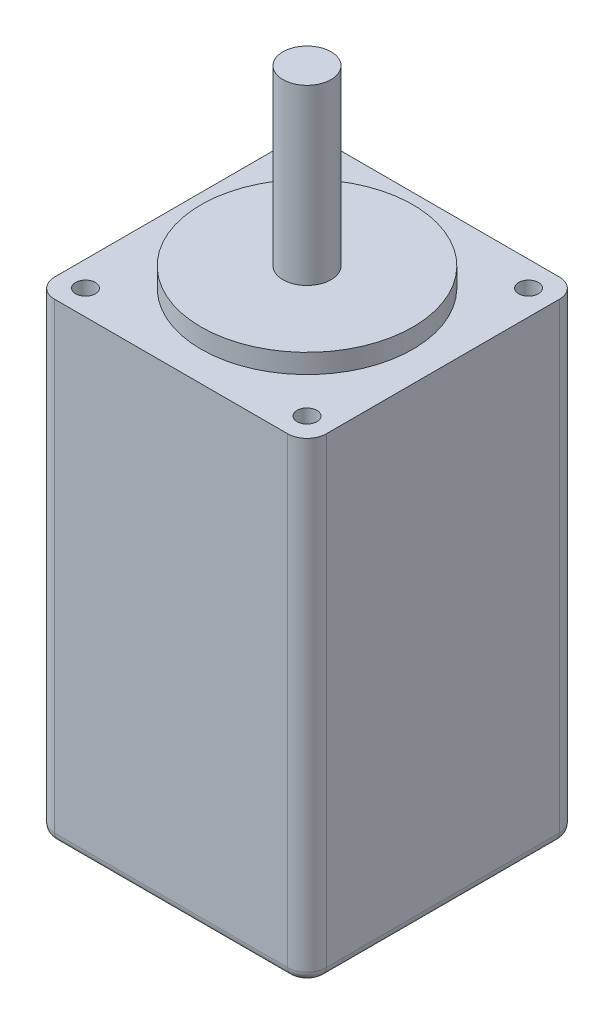
ISO-10303-21;
HEADER;
FILE_DESCRIPTION(('STEP AP214'),'2;1');
FILE_NAME('part.step','',(''),(''),'','','');
FILE_SCHEMA(('AUTOMOTIVE_DESIGN { 1 0 10303 214 1 1 1 1 }'));
ENDSEC;
DATA;
#1=APPLICATION_CONTEXT('core data for automotive mechanical design processes');
#2=APPLICATION_PROTOCOL_DEFINITION('international standard','automotive_design',2000,#1);
#3=PRODUCT_CONTEXT('',#1,'mechanical');
#4=PRODUCT('Part','Part','',(#3));
#5=PRODUCT_RELATED_PRODUCT_CATEGORY('part','',(#4));
#6=PRODUCT_DEFINITION_FORMATION('','',#4);
#7=PRODUCT_DEFINITION_CONTEXT('part definition',#1,'design');
#8=PRODUCT_DEFINITION('design','',#6,#7);
#9=PRODUCT_DEFINITION_SHAPE('','',#8);
#10=(LENGTH_UNIT() NAMED_UNIT(*) SI_UNIT(.MILLI.,.METRE.));
#11=(NAMED_UNIT(*) PLANE_ANGLE_UNIT() SI_UNIT($,.RADIAN.));
#12=(NAMED_UNIT(*) SI_UNIT($,.STERADIAN.) SOLID_ANGLE_UNIT());
#13=UNCERTAINTY_MEASURE_WITH_UNIT(LENGTH_MEASURE(1.E-05),#10,'distance_accuracy_value','');
#14=(GEOMETRIC_REPRESENTATION_CONTEXT(3) GLOBAL_UNCERTAINTY_ASSIGNED_CONTEXT((#13)) GLOBAL_UNIT_ASSIGNED_CONTEXT((#10,
#11,#12)) REPRESENTATION_CONTEXT('',''));
#15=CARTESIAN_POINT('',(0.,0.,0.));
#16=DIRECTION('',(0.,0.,1.));
#17=DIRECTION('',(1.,0.,0.));
#18=AXIS2_PLACEMENT_3D('',#15,#16,#17);
#19=CARTESIAN_POINT('',(0.,49.,0.));
#20=DIRECTION('',(0.,-1.,0.));
#21=DIRECTION('',(0.,0.,-1.));
#22=AXIS2_PLACEMENT_3D('',#19,#20,#21);
#23=PLANE('',#22);
#24=CARTESIAN_POINT('',(25.6,49.,-2.6));
#25=DIRECTION('',(0.,1.,0.));
#26=DIRECTION('',(0.,0.,1.));
#27=AXIS2_PLACEMENT_3D('',#24,#25,#26);
#28=CIRCLE('',#27,1.02499999999999);
#29=CARTESIAN_POINT('',(25.6,49.,-1.57500000000002));
#30=VERTEX_POINT('',#29);
#31=EDGE_CURVE('E144',#30,#30,#28,.T.);
#32=ORIENTED_EDGE('',*,*,#31,.F.);
#33=EDGE_LOOP('',(#32));
#34=FACE_BOUND('',#33,.T.);
#35=CARTESIAN_POINT('',(25.6,49.,-25.6));
#36=DIRECTION('',(0.,1.,0.));
#37=DIRECTION('',(0.,0.,1.));
#38=AXIS2_PLACEMENT_3D('',#35,#36,#37);
#39=CIRCLE('',#38,1.02499999999999);
#40=CARTESIAN_POINT('',(25.6,49.,-24.575));
#41=VERTEX_POINT('',#40);
#42=EDGE_CURVE('E155',#41,#41,#39,.T.);
#43=ORIENTED_EDGE('',*,*,#42,.F.);
#44=EDGE_LOOP('',(#43));
#45=FACE_BOUND('',#44,.T.);
#46=CARTESIAN_POINT('',(2.6,49.,-25.6));
#47=DIRECTION('',(0.,1.,0.));
#48=DIRECTION('',(0.,0.,1.));
#49=AXIS2_PLACEMENT_3D('',#46,#47,#48);
#50=CIRCLE('',#49,1.02499999999999);
#51=CARTESIAN_POINT('',(2.6,49.,-24.575));
#52=VERTEX_POINT('',#51);
#53=EDGE_CURVE('E161',#52,#52,#50,.T.);
#54=ORIENTED_EDGE('',*,*,#53,.F.);
#55=EDGE_LOOP('',(#54));
#56=FACE_BOUND('',#55,.T.);
#57=CARTESIAN_POINT('',(14.1,49.,-14.1));
#58=DIRECTION('',(0.,1.,0.));
#59=DIRECTION('',(0.,0.,1.));
#60=AXIS2_PLACEMENT_3D('',#57,#58,#59);
#61=CIRCLE('',#60,11.);
#62=CARTESIAN_POINT('',(14.1,49.,-3.1));
#63=VERTEX_POINT('',#62);
#64=EDGE_CURVE('E175',#63,#63,#61,.T.);
#65=ORIENTED_EDGE('',*,*,#64,.F.);
#66=EDGE_LOOP('',(#65));
#67=FACE_BOUND('',#66,.T.);
#68=DIRECTION('',(0.,0.,-1.));
#69=VECTOR('',#68,1.);
#70=CARTESIAN_POINT('',(28.2,49.,0.));
#71=LINE('',#70,#69);
#72=CARTESIAN_POINT('',(28.2,49.,-2.));
#73=VERTEX_POINT('',#72);
#74=CARTESIAN_POINT('',(28.2,49.,-26.2));
#75=VERTEX_POINT('',#74);
#76=EDGE_CURVE('E187',#73,#75,#71,.T.);
#77=ORIENTED_EDGE('',*,*,#76,.T.);
#78=CARTESIAN_POINT('',(26.2,49.,-26.2));
#79=DIRECTION('',(0.,-1.,0.));
#80=DIRECTION('',(0.,0.,-1.));
#81=AXIS2_PLACEMENT_3D('',#78,#79,#80);
#82=CIRCLE('',#81,2.);
#83=CARTESIAN_POINT('',(26.2,49.,-28.2));
#84=VERTEX_POINT('',#83);
#85=EDGE_CURVE('E206',#75,#84,#82,.F.);
#86=ORIENTED_EDGE('',*,*,#85,.T.);
#87=DIRECTION('',(-1.,0.,0.));
#88=VECTOR('',#87,1.);
#89=CARTESIAN_POINT('',(0.,49.,-28.2));
#90=LINE('',#89,#88);
#91=CARTESIAN_POINT('',(2.,49.,-28.2));
#92=VERTEX_POINT('',#91);
#93=EDGE_CURVE('E181',#84,#92,#90,.T.);
#94=ORIENTED_EDGE('',*,*,#93,.T.);
#95=CARTESIAN_POINT('',(2.,49.,-26.2));
#96=DIRECTION('',(0.,-1.,0.));
#97=DIRECTION('',(0.,0.,-1.));
#98=AXIS2_PLACEMENT_3D('',#95,#96,#97);
#99=CIRCLE('',#98,2.);
#100=CARTESIAN_POINT('',(0.,49.,-26.2));
#101=VERTEX_POINT('',#100);
#102=EDGE_CURVE('E204',#92,#101,#99,.F.);
#103=ORIENTED_EDGE('',*,*,#102,.T.);
#104=DIRECTION('',(0.,0.,1.));
#105=VECTOR('',#104,1.);
#106=CARTESIAN_POINT('',(0.,49.,0.));
#107=LINE('',#106,#105);
#108=CARTESIAN_POINT('',(0.,49.,-2.));
#109=VERTEX_POINT('',#108);
#110=EDGE_CURVE('E178',#101,#109,#107,.T.);
#111=ORIENTED_EDGE('',*,*,#110,.T.);
#112=CARTESIAN_POINT('',(2.,49.,-2.));
#113=DIRECTION('',(0.,-1.,0.));
#114=DIRECTION('',(0.,0.,-1.));
#115=AXIS2_PLACEMENT_3D('',#112,#113,#114);
#116=CIRCLE('',#115,2.);
#117=CARTESIAN_POINT('',(2.,49.,0.));
#118=VERTEX_POINT('',#117);
#119=EDGE_CURVE('E200',#109,#118,#116,.F.);
#120=ORIENTED_EDGE('',*,*,#119,.T.);
#121=DIRECTION('',(1.,0.,0.));
#122=VECTOR('',#121,1.);
#123=CARTESIAN_POINT('',(0.,49.,0.));
#124=LINE('',#123,#122);
#125=CARTESIAN_POINT('',(26.2,49.,0.));
#126=VERTEX_POINT('',#125);
#127=EDGE_CURVE('E184',#118,#126,#124,.T.);
#128=ORIENTED_EDGE('',*,*,#127,.T.);
#129=CARTESIAN_POINT('',(26.2,49.,-2.));
#130=DIRECTION('',(0.,-1.,0.));
#131=DIRECTION('',(0.,0.,-1.));
#132=AXIS2_PLACEMENT_3D('',#129,#130,#131);
#133=CIRCLE('',#132,2.);
#134=EDGE_CURVE('E202',#126,#73,#133,.F.);
#135=ORIENTED_EDGE('',*,*,#134,.T.);
#136=EDGE_LOOP('',(#77,#86,#94,#103,#111,#120,#128,#135));
#137=FACE_BOUND('',#136,.T.);
#138=CARTESIAN_POINT('',(2.6,49.,-2.6));
#139=DIRECTION('',(0.,1.,0.));
#140=DIRECTION('',(0.,0.,1.));
#141=AXIS2_PLACEMENT_3D('',#138,#139,#140);
#142=CIRCLE('',#141,1.02499999999999);
#143=CARTESIAN_POINT('',(2.6,49.,-1.57500000000001));
#144=VERTEX_POINT('',#143);
#145=EDGE_CURVE('E145',#144,#144,#142,.T.);
#146=ORIENTED_EDGE('',*,*,#145,.F.);
#147=EDGE_LOOP('',(#146));
#148=FACE_BOUND('',#147,.T.);
#149=ADVANCED_FACE('F34',(#34,#45,#56,#67,#137,#148),#23,.F.);
#150=CARTESIAN_POINT('',(0.,49.,0.));
#151=DIRECTION('',(1.,0.,0.));
#152=DIRECTION('',(0.,0.,-1.));
#153=AXIS2_PLACEMENT_3D('',#150,#151,#152);
#154=PLANE('',#153);
#155=DIRECTION('',(0.,-1.,0.));
#156=VECTOR('',#155,1.);
#157=CARTESIAN_POINT('',(0.,49.,-26.2));
#158=LINE('',#157,#156);
#159=CARTESIAN_POINT('',(0.,1.,-26.2));
#160=VERTEX_POINT('',#159);
#161=EDGE_CURVE('E210',#101,#160,#158,.T.);
#162=ORIENTED_EDGE('',*,*,#161,.T.);
#163=DIRECTION('',(0.,0.,1.));
#164=VECTOR('',#163,1.);
#165=CARTESIAN_POINT('',(0.,1.,-2.));
#166=LINE('',#165,#164);
#167=CARTESIAN_POINT('',(0.,1.,-2.));
#168=VERTEX_POINT('',#167);
#169=EDGE_CURVE('E237',#160,#168,#166,.T.);
#170=ORIENTED_EDGE('',*,*,#169,.T.);
#171=DIRECTION('',(0.,-1.,0.));
#172=VECTOR('',#171,1.);
#173=CARTESIAN_POINT('',(0.,49.,-2.));
#174=LINE('',#173,#172);
#175=EDGE_CURVE('E208',#168,#109,#174,.F.);
#176=ORIENTED_EDGE('',*,*,#175,.T.);
#177=ORIENTED_EDGE('',*,*,#110,.F.);
#178=EDGE_LOOP('',(#162,#170,#176,#177));
#179=FACE_BOUND('',#178,.T.);
#180=ADVANCED_FACE('F299',(#179),#154,.F.);
#181=CARTESIAN_POINT('',(0.,49.,0.));
#182=DIRECTION('',(0.,0.,-1.));
#183=DIRECTION('',(-1.,0.,0.));
#184=AXIS2_PLACEMENT_3D('',#181,#182,#183);
#185=PLANE('',#184);
#186=DIRECTION('',(0.,-1.,0.));
#187=VECTOR('',#186,1.);
#188=CARTESIAN_POINT('',(2.,49.,0.));
#189=LINE('',#188,#187);
#190=CARTESIAN_POINT('',(2.,1.,0.));
#191=VERTEX_POINT('',#190);
#192=EDGE_CURVE('E213',#118,#191,#189,.T.);
#193=ORIENTED_EDGE('',*,*,#192,.T.);
#194=DIRECTION('',(1.,0.,0.));
#195=VECTOR('',#194,1.);
#196=CARTESIAN_POINT('',(26.2,1.,0.));
#197=LINE('',#196,#195);
#198=CARTESIAN_POINT('',(26.2,1.,0.));
#199=VERTEX_POINT('',#198);
#200=EDGE_CURVE('E11',#191,#199,#197,.T.);
#201=ORIENTED_EDGE('',*,*,#200,.T.);
#202=DIRECTION('',(0.,-1.,0.));
#203=VECTOR('',#202,1.);
#204=CARTESIAN_POINT('',(26.2,49.,0.));
#205=LINE('',#204,#203);
#206=EDGE_CURVE('E215',#199,#126,#205,.F.);
#207=ORIENTED_EDGE('',*,*,#206,.T.);
#208=ORIENTED_EDGE('',*,*,#127,.F.);
#209=EDGE_LOOP('',(#193,#201,#207,#208));
#210=FACE_BOUND('',#209,.T.);
#211=ADVANCED_FACE('F319',(#210),#185,.F.);
#212=CARTESIAN_POINT('',(28.2,49.,0.));
#213=DIRECTION('',(-1.,0.,0.));
#214=DIRECTION('',(0.,0.,1.));
#215=AXIS2_PLACEMENT_3D('',#212,#213,#214);
#216=PLANE('',#215);
#217=DIRECTION('',(0.,-1.,0.));
#218=VECTOR('',#217,1.);
#219=CARTESIAN_POINT('',(28.2,49.,-2.));
#220=LINE('',#219,#218);
#221=CARTESIAN_POINT('',(28.2,1.,-2.));
#222=VERTEX_POINT('',#221);
#223=EDGE_CURVE('E196',#73,#222,#220,.T.);
#224=ORIENTED_EDGE('',*,*,#223,.T.);
#225=DIRECTION('',(0.,0.,-1.));
#226=VECTOR('',#225,1.);
#227=CARTESIAN_POINT('',(28.2,1.,-26.2));
#228=LINE('',#227,#226);
#229=CARTESIAN_POINT('',(28.2,1.,-26.2));
#230=VERTEX_POINT('',#229);
#231=EDGE_CURVE('E245',#222,#230,#228,.T.);
#232=ORIENTED_EDGE('',*,*,#231,.T.);
#233=DIRECTION('',(0.,-1.,0.));
#234=VECTOR('',#233,1.);
#235=CARTESIAN_POINT('',(28.2,49.,-26.2));
#236=LINE('',#235,#234);
#237=EDGE_CURVE('E198',#230,#75,#236,.F.);
#238=ORIENTED_EDGE('',*,*,#237,.T.);
#239=ORIENTED_EDGE('',*,*,#76,.F.);
#240=EDGE_LOOP('',(#224,#232,#238,#239));
#241=FACE_BOUND('',#240,.T.);
#242=ADVANCED_FACE('F324',(#241),#216,.F.);
#243=CARTESIAN_POINT('',(0.,49.,-28.2));
#244=DIRECTION('',(0.,0.,1.));
#245=DIRECTION('',(1.,0.,0.));
#246=AXIS2_PLACEMENT_3D('',#243,#244,#245);
#247=PLANE('',#246);
#248=DIRECTION('',(0.,-1.,0.));
#249=VECTOR('',#248,1.);
#250=CARTESIAN_POINT('',(26.2,49.,-28.2));
#251=LINE('',#250,#249);
#252=CARTESIAN_POINT('',(26.2,1.,-28.2));
#253=VERTEX_POINT('',#252);
#254=EDGE_CURVE('E193',#84,#253,#251,.T.);
#255=ORIENTED_EDGE('',*,*,#254,.T.);
#256=DIRECTION('',(-1.,0.,0.));
#257=VECTOR('',#256,1.);
#258=CARTESIAN_POINT('',(2.,1.,-28.2));
#259=LINE('',#258,#257);
#260=CARTESIAN_POINT('',(2.,1.,-28.2));
#261=VERTEX_POINT('',#260);
#262=EDGE_CURVE('E241',#253,#261,#259,.T.);
#263=ORIENTED_EDGE('',*,*,#262,.T.);
#264=DIRECTION('',(0.,-1.,0.));
#265=VECTOR('',#264,1.);
#266=CARTESIAN_POINT('',(2.,49.,-28.2));
#267=LINE('',#266,#265);
#268=EDGE_CURVE('E174',#261,#92,#267,.F.);
#269=ORIENTED_EDGE('',*,*,#268,.T.);
#270=ORIENTED_EDGE('',*,*,#93,.F.);
#271=EDGE_LOOP('',(#255,#263,#269,#270));
#272=FACE_BOUND('',#271,.T.);
#273=ADVANCED_FACE('F286',(#272),#247,.F.);
#274=CARTESIAN_POINT('',(0.,0.,0.));
#275=DIRECTION('',(0.,-1.,0.));
#276=DIRECTION('',(0.,0.,-1.));
#277=AXIS2_PLACEMENT_3D('',#274,#275,#276);
#278=PLANE('',#277);
#279=DIRECTION('',(1.,0.,0.));
#280=VECTOR('',#279,1.);
#281=CARTESIAN_POINT('',(2.,0.,-1.));
#282=LINE('',#281,#280);
#283=CARTESIAN_POINT('',(26.2,0.,-1.));
#284=VERTEX_POINT('',#283);
#285=CARTESIAN_POINT('',(2.,0.,-1.));
#286=VERTEX_POINT('',#285);
#287=EDGE_CURVE('E217',#284,#286,#282,.F.);
#288=ORIENTED_EDGE('',*,*,#287,.T.);
#289=CARTESIAN_POINT('',(2.,0.,-2.));
#290=DIRECTION('',(0.,-1.,0.));
#291=DIRECTION('',(0.,0.,-1.));
#292=AXIS2_PLACEMENT_3D('',#289,#290,#291);
#293=CIRCLE('',#292,1.);
#294=CARTESIAN_POINT('',(1.,0.,-2.));
#295=VERTEX_POINT('',#294);
#296=EDGE_CURVE('E231',#286,#295,#293,.T.);
#297=ORIENTED_EDGE('',*,*,#296,.T.);
#298=DIRECTION('',(0.,0.,1.));
#299=VECTOR('',#298,1.);
#300=CARTESIAN_POINT('',(1.,0.,-26.2));
#301=LINE('',#300,#299);
#302=CARTESIAN_POINT('',(1.,0.,-26.2));
#303=VERTEX_POINT('',#302);
#304=EDGE_CURVE('E229',#295,#303,#301,.F.);
#305=ORIENTED_EDGE('',*,*,#304,.T.);
#306=CARTESIAN_POINT('',(2.,0.,-26.2));
#307=DIRECTION('',(0.,-1.,0.));
#308=DIRECTION('',(0.,0.,-1.));
#309=AXIS2_PLACEMENT_3D('',#306,#307,#308);
#310=CIRCLE('',#309,1.);
#311=CARTESIAN_POINT('',(2.,0.,-27.2));
#312=VERTEX_POINT('',#311);
#313=EDGE_CURVE('E227',#303,#312,#310,.T.);
#314=ORIENTED_EDGE('',*,*,#313,.T.);
#315=DIRECTION('',(-1.,0.,0.));
#316=VECTOR('',#315,1.);
#317=CARTESIAN_POINT('',(26.2,0.,-27.2));
#318=LINE('',#317,#316);
#319=CARTESIAN_POINT('',(26.2,0.,-27.2));
#320=VERTEX_POINT('',#319);
#321=EDGE_CURVE('E225',#312,#320,#318,.F.);
#322=ORIENTED_EDGE('',*,*,#321,.T.);
#323=CARTESIAN_POINT('',(26.2,0.,-26.2));
#324=DIRECTION('',(0.,-1.,0.));
#325=DIRECTION('',(0.,0.,-1.));
#326=AXIS2_PLACEMENT_3D('',#323,#324,#325);
#327=CIRCLE('',#326,1.);
#328=CARTESIAN_POINT('',(27.2,0.,-26.2));
#329=VERTEX_POINT('',#328);
#330=EDGE_CURVE('E223',#320,#329,#327,.T.);
#331=ORIENTED_EDGE('',*,*,#330,.T.);
#332=DIRECTION('',(0.,0.,-1.));
#333=VECTOR('',#332,1.);
#334=CARTESIAN_POINT('',(27.2,0.,-2.));
#335=LINE('',#334,#333);
#336=CARTESIAN_POINT('',(27.2,0.,-2.));
#337=VERTEX_POINT('',#336);
#338=EDGE_CURVE('E221',#329,#337,#335,.F.);
#339=ORIENTED_EDGE('',*,*,#338,.T.);
#340=CARTESIAN_POINT('',(26.2,0.,-2.));
#341=DIRECTION('',(0.,-1.,0.));
#342=DIRECTION('',(0.,0.,-1.));
#343=AXIS2_PLACEMENT_3D('',#340,#341,#342);
#344=CIRCLE('',#343,1.);
#345=EDGE_CURVE('E219',#337,#284,#344,.T.);
#346=ORIENTED_EDGE('',*,*,#345,.T.);
#347=EDGE_LOOP('',(#288,#297,#305,#314,#322,#331,#339,#346));
#348=FACE_BOUND('',#347,.T.);
#349=ADVANCED_FACE('F331',(#348),#278,.T.);
#350=CARTESIAN_POINT('',(14.1,51.,-14.1));
#351=DIRECTION('',(0.,-1.,0.));
#352=DIRECTION('',(0.,0.,-1.));
#353=AXIS2_PLACEMENT_3D('',#350,#351,#352);
#354=CYLINDRICAL_SURFACE('',#353,11.);
#355=CARTESIAN_POINT('',(14.1,51.,-14.1));
#356=DIRECTION('',(0.,1.,0.));
#357=DIRECTION('',(0.,0.,1.));
#358=AXIS2_PLACEMENT_3D('',#355,#356,#357);
#359=CIRCLE('',#358,11.);
#360=CARTESIAN_POINT('',(14.1,51.,-3.1));
#361=VERTEX_POINT('',#360);
#362=EDGE_CURVE('E170',#361,#361,#359,.T.);
#363=ORIENTED_EDGE('',*,*,#362,.F.);
#364=EDGE_LOOP('',(#363));
#365=FACE_BOUND('',#364,.T.);
#366=ORIENTED_EDGE('',*,*,#64,.T.);
#367=EDGE_LOOP('',(#366));
#368=FACE_BOUND('',#367,.T.);
#369=ADVANCED_FACE('F345',(#365,#368),#354,.T.);
#370=CARTESIAN_POINT('',(14.1,51.,-14.1));
#371=DIRECTION('',(0.,1.,0.));
#372=DIRECTION('',(0.,0.,1.));
#373=AXIS2_PLACEMENT_3D('',#370,#371,#372);
#374=PLANE('',#373);
#375=CARTESIAN_POINT('',(14.1,51.,-14.1));
#376=DIRECTION('',(0.,1.,0.));
#377=DIRECTION('',(0.,0.,1.));
#378=AXIS2_PLACEMENT_3D('',#375,#376,#377);
#379=CIRCLE('',#378,2.5);
#380=CARTESIAN_POINT('',(14.1,51.,-11.6));
#381=VERTEX_POINT('',#380);
#382=EDGE_CURVE('E171',#381,#381,#379,.T.);
#383=ORIENTED_EDGE('',*,*,#382,.F.);
#384=EDGE_LOOP('',(#383));
#385=FACE_BOUND('',#384,.T.);
#386=ORIENTED_EDGE('',*,*,#362,.T.);
#387=EDGE_LOOP('',(#386));
#388=FACE_BOUND('',#387,.T.);
#389=ADVANCED_FACE('F352',(#385,#388),#374,.T.);
#390=CARTESIAN_POINT('',(14.1,69.,-14.1));
#391=DIRECTION('',(0.,-1.,0.));
#392=DIRECTION('',(0.,0.,-1.));
#393=AXIS2_PLACEMENT_3D('',#390,#391,#392);
#394=CYLINDRICAL_SURFACE('',#393,2.5);
#395=CARTESIAN_POINT('',(14.1,69.,-14.1));
#396=DIRECTION('',(0.,1.,0.));
#397=DIRECTION('',(0.,0.,1.));
#398=AXIS2_PLACEMENT_3D('',#395,#396,#397);
#399=CIRCLE('',#398,2.5);
#400=CARTESIAN_POINT('',(14.1,69.,-11.6));
#401=VERTEX_POINT('',#400);
#402=EDGE_CURVE('E167',#401,#401,#399,.T.);
#403=ORIENTED_EDGE('',*,*,#402,.F.);
#404=EDGE_LOOP('',(#403));
#405=FACE_BOUND('',#404,.T.);
#406=ORIENTED_EDGE('',*,*,#382,.T.);
#407=EDGE_LOOP('',(#406));
#408=FACE_BOUND('',#407,.T.);
#409=ADVANCED_FACE('F409',(#405,#408),#394,.T.);
#410=CARTESIAN_POINT('',(14.1,69.,-14.1));
#411=DIRECTION('',(0.,1.,0.));
#412=DIRECTION('',(0.,0.,1.));
#413=AXIS2_PLACEMENT_3D('',#410,#411,#412);
#414=PLANE('',#413);
#415=ORIENTED_EDGE('',*,*,#402,.T.);
#416=EDGE_LOOP('',(#415));
#417=FACE_BOUND('',#416,.T.);
#418=ADVANCED_FACE('F406',(#417),#414,.T.);
#419=CARTESIAN_POINT('',(26.2,49.,-26.2));
#420=DIRECTION('',(0.,-1.,0.));
#421=DIRECTION('',(0.,0.,-1.));
#422=AXIS2_PLACEMENT_3D('',#419,#420,#421);
#423=CYLINDRICAL_SURFACE('',#422,2.);
#424=ORIENTED_EDGE('',*,*,#237,.F.);
#425=CARTESIAN_POINT('',(26.2,1.,-26.2));
#426=DIRECTION('',(0.,-1.,0.));
#427=DIRECTION('',(0.,0.,-1.));
#428=AXIS2_PLACEMENT_3D('',#425,#426,#427);
#429=CIRCLE('',#428,2.);
#430=EDGE_CURVE('E243',#230,#253,#429,.F.);
#431=ORIENTED_EDGE('',*,*,#430,.T.);
#432=ORIENTED_EDGE('',*,*,#254,.F.);
#433=ORIENTED_EDGE('',*,*,#85,.F.);
#434=EDGE_LOOP('',(#424,#431,#432,#433));
#435=FACE_BOUND('',#434,.T.);
#436=ADVANCED_FACE('F282',(#435),#423,.T.);
#437=CARTESIAN_POINT('',(2.,49.,-26.2));
#438=DIRECTION('',(0.,-1.,0.));
#439=DIRECTION('',(0.,0.,-1.));
#440=AXIS2_PLACEMENT_3D('',#437,#438,#439);
#441=CYLINDRICAL_SURFACE('',#440,2.);
#442=ORIENTED_EDGE('',*,*,#268,.F.);
#443=CARTESIAN_POINT('',(2.,1.,-26.2));
#444=DIRECTION('',(0.,-1.,0.));
#445=DIRECTION('',(0.,0.,-1.));
#446=AXIS2_PLACEMENT_3D('',#443,#444,#445);
#447=CIRCLE('',#446,2.);
#448=EDGE_CURVE('E239',#261,#160,#447,.F.);
#449=ORIENTED_EDGE('',*,*,#448,.T.);
#450=ORIENTED_EDGE('',*,*,#161,.F.);
#451=ORIENTED_EDGE('',*,*,#102,.F.);
#452=EDGE_LOOP('',(#442,#449,#450,#451));
#453=FACE_BOUND('',#452,.T.);
#454=ADVANCED_FACE('F294',(#453),#441,.T.);
#455=CARTESIAN_POINT('',(26.2,49.,-2.));
#456=DIRECTION('',(0.,-1.,0.));
#457=DIRECTION('',(0.,0.,-1.));
#458=AXIS2_PLACEMENT_3D('',#455,#456,#457);
#459=CYLINDRICAL_SURFACE('',#458,2.);
#460=ORIENTED_EDGE('',*,*,#206,.F.);
#461=CARTESIAN_POINT('',(26.2,1.,-2.));
#462=DIRECTION('',(0.,-1.,0.));
#463=DIRECTION('',(0.,0.,-1.));
#464=AXIS2_PLACEMENT_3D('',#461,#462,#463);
#465=CIRCLE('',#464,2.);
#466=EDGE_CURVE('E43',#199,#222,#465,.F.);
#467=ORIENTED_EDGE('',*,*,#466,.T.);
#468=ORIENTED_EDGE('',*,*,#223,.F.);
#469=ORIENTED_EDGE('',*,*,#134,.F.);
#470=EDGE_LOOP('',(#460,#467,#468,#469));
#471=FACE_BOUND('',#470,.T.);
#472=ADVANCED_FACE('F322',(#471),#459,.T.);
#473=CARTESIAN_POINT('',(2.,49.,-2.));
#474=DIRECTION('',(0.,-1.,0.));
#475=DIRECTION('',(0.,0.,-1.));
#476=AXIS2_PLACEMENT_3D('',#473,#474,#475);
#477=CYLINDRICAL_SURFACE('',#476,2.);
#478=ORIENTED_EDGE('',*,*,#175,.F.);
#479=CARTESIAN_POINT('',(2.,1.,-2.));
#480=DIRECTION('',(0.,-1.,0.));
#481=DIRECTION('',(0.,0.,-1.));
#482=AXIS2_PLACEMENT_3D('',#479,#480,#481);
#483=CIRCLE('',#482,2.);
#484=EDGE_CURVE('E234',#168,#191,#483,.F.);
#485=ORIENTED_EDGE('',*,*,#484,.T.);
#486=ORIENTED_EDGE('',*,*,#192,.F.);
#487=ORIENTED_EDGE('',*,*,#119,.F.);
#488=EDGE_LOOP('',(#478,#485,#486,#487));
#489=FACE_BOUND('',#488,.T.);
#490=ADVANCED_FACE('F316',(#489),#477,.T.);
#491=CARTESIAN_POINT('',(2.6,44.5,-25.6));
#492=DIRECTION('',(0.,1.,0.));
#493=DIRECTION('',(0.,0.,1.));
#494=AXIS2_PLACEMENT_3D('',#491,#492,#493);
#495=CONICAL_SURFACE('',#494,1.02499999999999,1.02974425867665);
#496=CARTESIAN_POINT('',(2.6,43.8841178654967,-25.6));
#497=VERTEX_POINT('',#496);
#498=VERTEX_LOOP('',#497);
#499=FACE_BOUND('',#498,.T.);
#500=CARTESIAN_POINT('',(2.6,44.5,-25.6));
#501=DIRECTION('',(0.,1.,0.));
#502=DIRECTION('',(0.,0.,1.));
#503=AXIS2_PLACEMENT_3D('',#500,#501,#502);
#504=CIRCLE('',#503,1.02499999999999);
#505=CARTESIAN_POINT('',(2.6,44.5,-24.575));
#506=VERTEX_POINT('',#505);
#507=EDGE_CURVE('E164',#506,#506,#504,.T.);
#508=ORIENTED_EDGE('',*,*,#507,.T.);
#509=EDGE_LOOP('',(#508));
#510=FACE_BOUND('',#509,.T.);
#511=ADVANCED_FACE('F401',(#499,#510),#495,.F.);
#512=CARTESIAN_POINT('',(2.6,49.,-25.6));
#513=DIRECTION('',(0.,1.,0.));
#514=DIRECTION('',(0.,0.,1.));
#515=AXIS2_PLACEMENT_3D('',#512,#513,#514);
#516=CYLINDRICAL_SURFACE('',#515,1.02499999999999);
#517=ORIENTED_EDGE('',*,*,#507,.F.);
#518=EDGE_LOOP('',(#517));
#519=FACE_BOUND('',#518,.T.);
#520=ORIENTED_EDGE('',*,*,#53,.T.);
#521=EDGE_LOOP('',(#520));
#522=FACE_BOUND('',#521,.T.);
#523=ADVANCED_FACE('F397',(#519,#522),#516,.F.);
#524=CARTESIAN_POINT('',(25.6,44.5,-25.6));
#525=DIRECTION('',(0.,1.,0.));
#526=DIRECTION('',(0.,0.,1.));
#527=AXIS2_PLACEMENT_3D('',#524,#525,#526);
#528=CONICAL_SURFACE('',#527,1.02499999999999,1.02974425867665);
#529=CARTESIAN_POINT('',(25.6,43.8841178654967,-25.6));
#530=VERTEX_POINT('',#529);
#531=VERTEX_LOOP('',#530);
#532=FACE_BOUND('',#531,.T.);
#533=CARTESIAN_POINT('',(25.6,44.5,-25.6));
#534=DIRECTION('',(0.,1.,0.));
#535=DIRECTION('',(0.,0.,1.));
#536=AXIS2_PLACEMENT_3D('',#533,#534,#535);
#537=CIRCLE('',#536,1.02499999999999);
#538=CARTESIAN_POINT('',(25.6,44.5,-24.575));
#539=VERTEX_POINT('',#538);
#540=EDGE_CURVE('E158',#539,#539,#537,.T.);
#541=ORIENTED_EDGE('',*,*,#540,.T.);
#542=EDGE_LOOP('',(#541));
#543=FACE_BOUND('',#542,.T.);
#544=ADVANCED_FACE('F393',(#532,#543),#528,.F.);
#545=CARTESIAN_POINT('',(25.6,49.,-25.6));
#546=DIRECTION('',(0.,1.,0.));
#547=DIRECTION('',(0.,0.,1.));
#548=AXIS2_PLACEMENT_3D('',#545,#546,#547);
#549=CYLINDRICAL_SURFACE('',#548,1.02499999999999);
#550=ORIENTED_EDGE('',*,*,#540,.F.);
#551=EDGE_LOOP('',(#550));
#552=FACE_BOUND('',#551,.T.);
#553=ORIENTED_EDGE('',*,*,#42,.T.);
#554=EDGE_LOOP('',(#553));
#555=FACE_BOUND('',#554,.T.);
#556=ADVANCED_FACE('F389',(#552,#555),#549,.F.);
#557=CARTESIAN_POINT('',(25.6,44.5,-2.6));
#558=DIRECTION('',(0.,1.,0.));
#559=DIRECTION('',(0.,0.,1.));
#560=AXIS2_PLACEMENT_3D('',#557,#558,#559);
#561=CONICAL_SURFACE('',#560,1.02499999999999,1.02974425867665);
#562=CARTESIAN_POINT('',(25.6,43.8841178654967,-2.6));
#563=VERTEX_POINT('',#562);
#564=VERTEX_LOOP('',#563);
#565=FACE_BOUND('',#564,.T.);
#566=CARTESIAN_POINT('',(25.6,44.5,-2.6));
#567=DIRECTION('',(0.,1.,0.));
#568=DIRECTION('',(0.,0.,1.));
#569=AXIS2_PLACEMENT_3D('',#566,#567,#568);
#570=CIRCLE('',#569,1.02499999999999);
#571=CARTESIAN_POINT('',(25.6,44.5,-1.57500000000001));
#572=VERTEX_POINT('',#571);
#573=EDGE_CURVE('E148',#572,#572,#570,.T.);
#574=ORIENTED_EDGE('',*,*,#573,.T.);
#575=EDGE_LOOP('',(#574));
#576=FACE_BOUND('',#575,.T.);
#577=ADVANCED_FACE('F385',(#565,#576),#561,.F.);
#578=CARTESIAN_POINT('',(25.6,49.,-2.6));
#579=DIRECTION('',(0.,1.,0.));
#580=DIRECTION('',(0.,0.,1.));
#581=AXIS2_PLACEMENT_3D('',#578,#579,#580);
#582=CYLINDRICAL_SURFACE('',#581,1.02499999999999);
#583=ORIENTED_EDGE('',*,*,#573,.F.);
#584=EDGE_LOOP('',(#583));
#585=FACE_BOUND('',#584,.T.);
#586=ORIENTED_EDGE('',*,*,#31,.T.);
#587=EDGE_LOOP('',(#586));
#588=FACE_BOUND('',#587,.T.);
#589=ADVANCED_FACE('F138',(#585,#588),#582,.F.);
#590=CARTESIAN_POINT('',(2.6,44.5,-2.6));
#591=DIRECTION('',(0.,1.,0.));
#592=DIRECTION('',(0.,0.,1.));
#593=AXIS2_PLACEMENT_3D('',#590,#591,#592);
#594=CONICAL_SURFACE('',#593,1.02499999999999,1.02974425867665);
#595=CARTESIAN_POINT('',(2.6,43.8841178654967,-2.6));
#596=VERTEX_POINT('',#595);
#597=VERTEX_LOOP('',#596);
#598=FACE_BOUND('',#597,.T.);
#599=CARTESIAN_POINT('',(2.6,44.5,-2.6));
#600=DIRECTION('',(0.,1.,0.));
#601=DIRECTION('',(0.,0.,1.));
#602=AXIS2_PLACEMENT_3D('',#599,#600,#601);
#603=CIRCLE('',#602,1.02499999999999);
#604=CARTESIAN_POINT('',(2.6,44.5,-1.57500000000001));
#605=VERTEX_POINT('',#604);
#606=EDGE_CURVE('E142',#605,#605,#603,.T.);
#607=ORIENTED_EDGE('',*,*,#606,.T.);
#608=EDGE_LOOP('',(#607));
#609=FACE_BOUND('',#608,.T.);
#610=ADVANCED_FACE('F134',(#598,#609),#594,.F.);
#611=CARTESIAN_POINT('',(2.6,49.,-2.6));
#612=DIRECTION('',(0.,1.,0.));
#613=DIRECTION('',(0.,0.,1.));
#614=AXIS2_PLACEMENT_3D('',#611,#612,#613);
#615=CYLINDRICAL_SURFACE('',#614,1.02499999999999);
#616=ORIENTED_EDGE('',*,*,#606,.F.);
#617=EDGE_LOOP('',(#616));
#618=FACE_BOUND('',#617,.T.);
#619=ORIENTED_EDGE('',*,*,#145,.T.);
#620=EDGE_LOOP('',(#619));
#621=FACE_BOUND('',#620,.T.);
#622=ADVANCED_FACE('F137',(#618,#621),#615,.F.);
#623=CARTESIAN_POINT('',(26.2,1.,-26.2));
#624=DIRECTION('',(0.,-1.,0.));
#625=DIRECTION('',(0.,0.,-1.));
#626=AXIS2_PLACEMENT_3D('',#623,#624,#625);
#627=DEGENERATE_TOROIDAL_SURFACE('',#626,1.,1.,.T.);
#628=CARTESIAN_POINT('',(26.2,1.,-27.2));
#629=DIRECTION('',(-1.,0.,0.));
#630=DIRECTION('',(0.,0.,1.));
#631=AXIS2_PLACEMENT_3D('',#628,#629,#630);
#632=CIRCLE('',#631,1.);
#633=EDGE_CURVE('E263',#253,#320,#632,.T.);
#634=ORIENTED_EDGE('',*,*,#633,.F.);
#635=ORIENTED_EDGE('',*,*,#430,.F.);
#636=CARTESIAN_POINT('',(27.2,1.,-26.2));
#637=DIRECTION('',(0.,0.,1.));
#638=DIRECTION('',(1.,0.,0.));
#639=AXIS2_PLACEMENT_3D('',#636,#637,#638);
#640=CIRCLE('',#639,1.);
#641=EDGE_CURVE('E38',#329,#230,#640,.T.);
#642=ORIENTED_EDGE('',*,*,#641,.F.);
#643=ORIENTED_EDGE('',*,*,#330,.F.);
#644=EDGE_LOOP('',(#634,#635,#642,#643));
#645=FACE_BOUND('',#644,.T.);
#646=ADVANCED_FACE('F36',(#645),#627,.T.);
#647=CARTESIAN_POINT('',(27.2,1.,0.));
#648=DIRECTION('',(0.,0.,1.));
#649=DIRECTION('',(1.,0.,0.));
#650=AXIS2_PLACEMENT_3D('',#647,#648,#649);
#651=CYLINDRICAL_SURFACE('',#650,1.);
#652=ORIENTED_EDGE('',*,*,#641,.T.);
#653=ORIENTED_EDGE('',*,*,#231,.F.);
#654=CARTESIAN_POINT('',(27.2,1.,-2.));
#655=DIRECTION('',(0.,0.,1.));
#656=DIRECTION('',(1.,0.,0.));
#657=AXIS2_PLACEMENT_3D('',#654,#655,#656);
#658=CIRCLE('',#657,1.);
#659=EDGE_CURVE('E261',#337,#222,#658,.T.);
#660=ORIENTED_EDGE('',*,*,#659,.F.);
#661=ORIENTED_EDGE('',*,*,#338,.F.);
#662=EDGE_LOOP('',(#652,#653,#660,#661));
#663=FACE_BOUND('',#662,.T.);
#664=ADVANCED_FACE('F274',(#663),#651,.T.);
#665=CARTESIAN_POINT('',(0.,1.,-27.2));
#666=DIRECTION('',(1.,0.,0.));
#667=DIRECTION('',(0.,0.,-1.));
#668=AXIS2_PLACEMENT_3D('',#665,#666,#667);
#669=CYLINDRICAL_SURFACE('',#668,1.);
#670=ORIENTED_EDGE('',*,*,#633,.T.);
#671=ORIENTED_EDGE('',*,*,#321,.F.);
#672=CARTESIAN_POINT('',(2.,1.,-27.2));
#673=DIRECTION('',(-1.,0.,0.));
#674=DIRECTION('',(0.,0.,1.));
#675=AXIS2_PLACEMENT_3D('',#672,#673,#674);
#676=CIRCLE('',#675,1.);
#677=EDGE_CURVE('E258',#261,#312,#676,.T.);
#678=ORIENTED_EDGE('',*,*,#677,.F.);
#679=ORIENTED_EDGE('',*,*,#262,.F.);
#680=EDGE_LOOP('',(#670,#671,#678,#679));
#681=FACE_BOUND('',#680,.T.);
#682=ADVANCED_FACE('F362',(#681),#669,.T.);
#683=CARTESIAN_POINT('',(26.2,1.,-2.));
#684=DIRECTION('',(0.,-1.,0.));
#685=DIRECTION('',(0.,0.,-1.));
#686=AXIS2_PLACEMENT_3D('',#683,#684,#685);
#687=DEGENERATE_TOROIDAL_SURFACE('',#686,1.,1.,.T.);
#688=ORIENTED_EDGE('',*,*,#659,.T.);
#689=ORIENTED_EDGE('',*,*,#466,.F.);
#690=CARTESIAN_POINT('',(26.2,1.,-1.));
#691=DIRECTION('',(-1.,0.,0.));
#692=DIRECTION('',(0.,0.,1.));
#693=AXIS2_PLACEMENT_3D('',#690,#691,#692);
#694=CIRCLE('',#693,1.);
#695=EDGE_CURVE('E255',#284,#199,#694,.T.);
#696=ORIENTED_EDGE('',*,*,#695,.F.);
#697=ORIENTED_EDGE('',*,*,#345,.F.);
#698=EDGE_LOOP('',(#688,#689,#696,#697));
#699=FACE_BOUND('',#698,.T.);
#700=ADVANCED_FACE('F360',(#699),#687,.T.);
#701=CARTESIAN_POINT('',(2.,1.,-26.2));
#702=DIRECTION('',(0.,-1.,0.));
#703=DIRECTION('',(0.,0.,-1.));
#704=AXIS2_PLACEMENT_3D('',#701,#702,#703);
#705=DEGENERATE_TOROIDAL_SURFACE('',#704,1.,1.,.T.);
#706=ORIENTED_EDGE('',*,*,#677,.T.);
#707=ORIENTED_EDGE('',*,*,#313,.F.);
#708=CARTESIAN_POINT('',(1.,1.,-26.2));
#709=DIRECTION('',(0.,0.,1.));
#710=DIRECTION('',(1.,0.,0.));
#711=AXIS2_PLACEMENT_3D('',#708,#709,#710);
#712=CIRCLE('',#711,1.);
#713=EDGE_CURVE('E252',#160,#303,#712,.T.);
#714=ORIENTED_EDGE('',*,*,#713,.F.);
#715=ORIENTED_EDGE('',*,*,#448,.F.);
#716=EDGE_LOOP('',(#706,#707,#714,#715));
#717=FACE_BOUND('',#716,.T.);
#718=ADVANCED_FACE('F304',(#717),#705,.T.);
#719=CARTESIAN_POINT('',(0.,1.,-1.));
#720=DIRECTION('',(-1.,0.,0.));
#721=DIRECTION('',(0.,0.,1.));
#722=AXIS2_PLACEMENT_3D('',#719,#720,#721);
#723=CYLINDRICAL_SURFACE('',#722,1.);
#724=ORIENTED_EDGE('',*,*,#695,.T.);
#725=ORIENTED_EDGE('',*,*,#200,.F.);
#726=CARTESIAN_POINT('',(2.,1.,-1.));
#727=DIRECTION('',(-1.,0.,0.));
#728=DIRECTION('',(0.,0.,1.));
#729=AXIS2_PLACEMENT_3D('',#726,#727,#728);
#730=CIRCLE('',#729,1.);
#731=EDGE_CURVE('E250',#286,#191,#730,.T.);
#732=ORIENTED_EDGE('',*,*,#731,.F.);
#733=ORIENTED_EDGE('',*,*,#287,.F.);
#734=EDGE_LOOP('',(#724,#725,#732,#733));
#735=FACE_BOUND('',#734,.T.);
#736=ADVANCED_FACE('F358',(#735),#723,.T.);
#737=CARTESIAN_POINT('',(1.,1.,0.));
#738=DIRECTION('',(0.,0.,-1.));
#739=DIRECTION('',(-1.,0.,0.));
#740=AXIS2_PLACEMENT_3D('',#737,#738,#739);
#741=CYLINDRICAL_SURFACE('',#740,1.);
#742=ORIENTED_EDGE('',*,*,#713,.T.);
#743=ORIENTED_EDGE('',*,*,#304,.F.);
#744=CARTESIAN_POINT('',(1.,1.,-2.));
#745=DIRECTION('',(0.,0.,1.));
#746=DIRECTION('',(1.,0.,0.));
#747=AXIS2_PLACEMENT_3D('',#744,#745,#746);
#748=CIRCLE('',#747,1.);
#749=EDGE_CURVE('E248',#168,#295,#748,.T.);
#750=ORIENTED_EDGE('',*,*,#749,.F.);
#751=ORIENTED_EDGE('',*,*,#169,.F.);
#752=EDGE_LOOP('',(#742,#743,#750,#751));
#753=FACE_BOUND('',#752,.T.);
#754=ADVANCED_FACE('F308',(#753),#741,.T.);
#755=CARTESIAN_POINT('',(2.,1.,-2.));
#756=DIRECTION('',(0.,-1.,0.));
#757=DIRECTION('',(0.,0.,-1.));
#758=AXIS2_PLACEMENT_3D('',#755,#756,#757);
#759=DEGENERATE_TOROIDAL_SURFACE('',#758,1.,1.,.T.);
#760=ORIENTED_EDGE('',*,*,#731,.T.);
#761=ORIENTED_EDGE('',*,*,#484,.F.);
#762=ORIENTED_EDGE('',*,*,#749,.T.);
#763=ORIENTED_EDGE('',*,*,#296,.F.);
#764=EDGE_LOOP('',(#760,#761,#762,#763));
#765=FACE_BOUND('',#764,.T.);
#766=ADVANCED_FACE('F312',(#765),#759,.T.);
#767=CLOSED_SHELL('',(#149,#180,#211,#242,#273,#349,#369,#389,#409,#418,#436,#454,#472,#490,
#511,#523,#544,#556,#577,#589,#610,#622,#646,#664,#682,#700,#718,#736,#754,#766));
#768=MANIFOLD_SOLID_BREP('B2',#767);
#769=ADVANCED_BREP_SHAPE_REPRESENTATION('',(#18,#768),#14);
#770=SHAPE_DEFINITION_REPRESENTATION(#9,#769);
ENDSEC;
END-ISO-10303-21;
